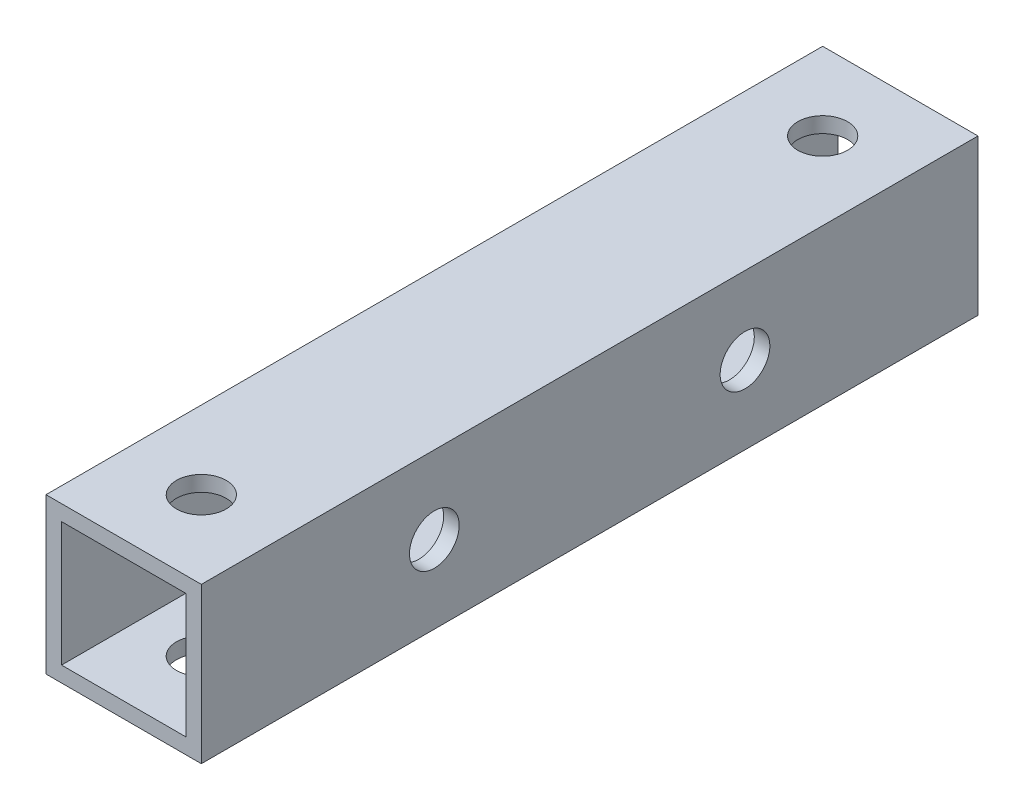
ISO-10303-21;
HEADER;
FILE_DESCRIPTION(('STEP AP214'),'2;1');
FILE_NAME('part.step','',(''),(''),'','','');
FILE_SCHEMA(('AUTOMOTIVE_DESIGN { 1 0 10303 214 1 1 1 1 }'));
ENDSEC;
DATA;
#1=APPLICATION_CONTEXT('core data for automotive mechanical design processes');
#2=APPLICATION_PROTOCOL_DEFINITION('international standard','automotive_design',2000,#1);
#3=PRODUCT_CONTEXT('',#1,'mechanical');
#4=PRODUCT('Part','Part','',(#3));
#5=PRODUCT_RELATED_PRODUCT_CATEGORY('part','',(#4));
#6=PRODUCT_DEFINITION_FORMATION('','',#4);
#7=PRODUCT_DEFINITION_CONTEXT('part definition',#1,'design');
#8=PRODUCT_DEFINITION('design','',#6,#7);
#9=PRODUCT_DEFINITION_SHAPE('','',#8);
#10=(LENGTH_UNIT() NAMED_UNIT(*) SI_UNIT(.MILLI.,.METRE.));
#11=(NAMED_UNIT(*) PLANE_ANGLE_UNIT() SI_UNIT($,.RADIAN.));
#12=(NAMED_UNIT(*) SI_UNIT($,.STERADIAN.) SOLID_ANGLE_UNIT());
#13=UNCERTAINTY_MEASURE_WITH_UNIT(LENGTH_MEASURE(1.E-05),#10,'distance_accuracy_value','');
#14=(GEOMETRIC_REPRESENTATION_CONTEXT(3) GLOBAL_UNCERTAINTY_ASSIGNED_CONTEXT((#13)) GLOBAL_UNIT_ASSIGNED_CONTEXT((#10,
#11,#12)) REPRESENTATION_CONTEXT('',''));
#15=CARTESIAN_POINT('',(0.,0.,0.));
#16=DIRECTION('',(0.,0.,1.));
#17=DIRECTION('',(1.,0.,0.));
#18=AXIS2_PLACEMENT_3D('',#15,#16,#17);
#19=CARTESIAN_POINT('',(0.,0.,50.));
#20=DIRECTION('',(0.,0.,1.));
#21=DIRECTION('',(1.,0.,0.));
#22=AXIS2_PLACEMENT_3D('',#19,#20,#21);
#23=PLANE('',#22);
#24=DIRECTION('',(0.,1.,0.));
#25=VECTOR('',#24,1.);
#26=CARTESIAN_POINT('',(5.,5.,50.));
#27=LINE('',#26,#25);
#28=CARTESIAN_POINT('',(5.,-5.,50.));
#29=VERTEX_POINT('',#28);
#30=CARTESIAN_POINT('',(5.,5.,50.));
#31=VERTEX_POINT('',#30);
#32=EDGE_CURVE('E140',#29,#31,#27,.T.);
#33=ORIENTED_EDGE('',*,*,#32,.T.);
#34=DIRECTION('',(-1.,0.,0.));
#35=VECTOR('',#34,1.);
#36=CARTESIAN_POINT('',(-5.,5.,50.));
#37=LINE('',#36,#35);
#38=CARTESIAN_POINT('',(-5.,5.,50.));
#39=VERTEX_POINT('',#38);
#40=EDGE_CURVE('E143',#31,#39,#37,.T.);
#41=ORIENTED_EDGE('',*,*,#40,.T.);
#42=DIRECTION('',(0.,-1.,0.));
#43=VECTOR('',#42,1.);
#44=CARTESIAN_POINT('',(-5.,5.,50.));
#45=LINE('',#44,#43);
#46=CARTESIAN_POINT('',(-5.,-5.,50.));
#47=VERTEX_POINT('',#46);
#48=EDGE_CURVE('E146',#39,#47,#45,.T.);
#49=ORIENTED_EDGE('',*,*,#48,.T.);
#50=DIRECTION('',(1.,0.,0.));
#51=VECTOR('',#50,1.);
#52=CARTESIAN_POINT('',(-5.,-5.,50.));
#53=LINE('',#52,#51);
#54=EDGE_CURVE('E148',#47,#29,#53,.T.);
#55=ORIENTED_EDGE('',*,*,#54,.T.);
#56=EDGE_LOOP('',(#33,#41,#49,#55));
#57=FACE_BOUND('',#56,.T.);
#58=DIRECTION('',(0.,-1.,0.));
#59=VECTOR('',#58,1.);
#60=CARTESIAN_POINT('',(-4.,4.,50.));
#61=LINE('',#60,#59);
#62=CARTESIAN_POINT('',(-4.,4.,50.));
#63=VERTEX_POINT('',#62);
#64=CARTESIAN_POINT('',(-4.,-4.,50.));
#65=VERTEX_POINT('',#64);
#66=EDGE_CURVE('E110',#63,#65,#61,.T.);
#67=ORIENTED_EDGE('',*,*,#66,.F.);
#68=DIRECTION('',(-1.,0.,0.));
#69=VECTOR('',#68,1.);
#70=CARTESIAN_POINT('',(-4.,4.,50.));
#71=LINE('',#70,#69);
#72=CARTESIAN_POINT('',(4.,4.,50.));
#73=VERTEX_POINT('',#72);
#74=EDGE_CURVE('E102',#73,#63,#71,.T.);
#75=ORIENTED_EDGE('',*,*,#74,.F.);
#76=DIRECTION('',(0.,1.,0.));
#77=VECTOR('',#76,1.);
#78=CARTESIAN_POINT('',(4.,4.,50.));
#79=LINE('',#78,#77);
#80=CARTESIAN_POINT('',(4.,-4.,50.));
#81=VERTEX_POINT('',#80);
#82=EDGE_CURVE('E124',#81,#73,#79,.T.);
#83=ORIENTED_EDGE('',*,*,#82,.F.);
#84=DIRECTION('',(1.,0.,0.));
#85=VECTOR('',#84,1.);
#86=CARTESIAN_POINT('',(-4.,-4.,50.));
#87=LINE('',#86,#85);
#88=EDGE_CURVE('E122',#65,#81,#87,.T.);
#89=ORIENTED_EDGE('',*,*,#88,.F.);
#90=EDGE_LOOP('',(#67,#75,#83,#89));
#91=FACE_BOUND('',#90,.T.);
#92=ADVANCED_FACE('F35',(#57,#91),#23,.T.);
#93=CARTESIAN_POINT('',(0.,0.,0.));
#94=DIRECTION('',(0.,0.,1.));
#95=DIRECTION('',(1.,0.,0.));
#96=AXIS2_PLACEMENT_3D('',#93,#94,#95);
#97=PLANE('',#96);
#98=DIRECTION('',(0.,1.,0.));
#99=VECTOR('',#98,1.);
#100=CARTESIAN_POINT('',(5.,5.,0.));
#101=LINE('',#100,#99);
#102=CARTESIAN_POINT('',(5.,-5.,0.));
#103=VERTEX_POINT('',#102);
#104=CARTESIAN_POINT('',(5.,5.,0.));
#105=VERTEX_POINT('',#104);
#106=EDGE_CURVE('E118',#103,#105,#101,.T.);
#107=ORIENTED_EDGE('',*,*,#106,.F.);
#108=DIRECTION('',(1.,0.,0.));
#109=VECTOR('',#108,1.);
#110=CARTESIAN_POINT('',(-5.,-5.,0.));
#111=LINE('',#110,#109);
#112=CARTESIAN_POINT('',(-5.,-5.,0.));
#113=VERTEX_POINT('',#112);
#114=EDGE_CURVE('E144',#113,#103,#111,.T.);
#115=ORIENTED_EDGE('',*,*,#114,.F.);
#116=DIRECTION('',(0.,-1.,0.));
#117=VECTOR('',#116,1.);
#118=CARTESIAN_POINT('',(-5.,5.,0.));
#119=LINE('',#118,#117);
#120=CARTESIAN_POINT('',(-5.,5.,0.));
#121=VERTEX_POINT('',#120);
#122=EDGE_CURVE('E155',#121,#113,#119,.T.);
#123=ORIENTED_EDGE('',*,*,#122,.F.);
#124=DIRECTION('',(-1.,0.,0.));
#125=VECTOR('',#124,1.);
#126=CARTESIAN_POINT('',(-5.,5.,0.));
#127=LINE('',#126,#125);
#128=EDGE_CURVE('E153',#105,#121,#127,.T.);
#129=ORIENTED_EDGE('',*,*,#128,.F.);
#130=EDGE_LOOP('',(#107,#115,#123,#129));
#131=FACE_BOUND('',#130,.T.);
#132=DIRECTION('',(-1.,0.,0.));
#133=VECTOR('',#132,1.);
#134=CARTESIAN_POINT('',(-4.,4.,0.));
#135=LINE('',#134,#133);
#136=CARTESIAN_POINT('',(4.,4.,0.));
#137=VERTEX_POINT('',#136);
#138=CARTESIAN_POINT('',(-4.,4.,0.));
#139=VERTEX_POINT('',#138);
#140=EDGE_CURVE('E60',#137,#139,#135,.T.);
#141=ORIENTED_EDGE('',*,*,#140,.T.);
#142=DIRECTION('',(0.,-1.,0.));
#143=VECTOR('',#142,1.);
#144=CARTESIAN_POINT('',(-4.,4.,0.));
#145=LINE('',#144,#143);
#146=CARTESIAN_POINT('',(-4.,-4.,0.));
#147=VERTEX_POINT('',#146);
#148=EDGE_CURVE('E117',#139,#147,#145,.T.);
#149=ORIENTED_EDGE('',*,*,#148,.T.);
#150=DIRECTION('',(1.,0.,0.));
#151=VECTOR('',#150,1.);
#152=CARTESIAN_POINT('',(-4.,-4.,0.));
#153=LINE('',#152,#151);
#154=CARTESIAN_POINT('',(4.,-4.,0.));
#155=VERTEX_POINT('',#154);
#156=EDGE_CURVE('E132',#147,#155,#153,.T.);
#157=ORIENTED_EDGE('',*,*,#156,.T.);
#158=DIRECTION('',(0.,1.,0.));
#159=VECTOR('',#158,1.);
#160=CARTESIAN_POINT('',(4.,4.,0.));
#161=LINE('',#160,#159);
#162=EDGE_CURVE('E111',#155,#137,#161,.T.);
#163=ORIENTED_EDGE('',*,*,#162,.T.);
#164=EDGE_LOOP('',(#141,#149,#157,#163));
#165=FACE_BOUND('',#164,.T.);
#166=ADVANCED_FACE('F243',(#131,#165),#97,.F.);
#167=CARTESIAN_POINT('',(5.,5.,50.));
#168=DIRECTION('',(-1.,0.,0.));
#169=DIRECTION('',(0.,-1.,0.));
#170=AXIS2_PLACEMENT_3D('',#167,#168,#169);
#171=PLANE('',#170);
#172=CARTESIAN_POINT('',(5.,0.,15.));
#173=DIRECTION('',(-1.,0.,0.));
#174=DIRECTION('',(0.,-1.,0.));
#175=AXIS2_PLACEMENT_3D('',#172,#173,#174);
#176=CIRCLE('',#175,1.6);
#177=CARTESIAN_POINT('',(5.,-1.6,15.));
#178=VERTEX_POINT('',#177);
#179=EDGE_CURVE('E175',#178,#178,#176,.T.);
#180=ORIENTED_EDGE('',*,*,#179,.T.);
#181=EDGE_LOOP('',(#180));
#182=FACE_BOUND('',#181,.T.);
#183=CARTESIAN_POINT('',(5.,0.,35.));
#184=DIRECTION('',(-1.,0.,0.));
#185=DIRECTION('',(0.,-1.,0.));
#186=AXIS2_PLACEMENT_3D('',#183,#184,#185);
#187=CIRCLE('',#186,1.60000000000001);
#188=CARTESIAN_POINT('',(5.,-1.6,35.));
#189=VERTEX_POINT('',#188);
#190=EDGE_CURVE('E186',#189,#189,#187,.T.);
#191=ORIENTED_EDGE('',*,*,#190,.T.);
#192=EDGE_LOOP('',(#191));
#193=FACE_BOUND('',#192,.T.);
#194=ORIENTED_EDGE('',*,*,#106,.T.);
#195=DIRECTION('',(0.,0.,-1.));
#196=VECTOR('',#195,1.);
#197=CARTESIAN_POINT('',(5.,5.,50.));
#198=LINE('',#197,#196);
#199=EDGE_CURVE('E11',#31,#105,#198,.T.);
#200=ORIENTED_EDGE('',*,*,#199,.F.);
#201=ORIENTED_EDGE('',*,*,#32,.F.);
#202=DIRECTION('',(0.,0.,-1.));
#203=VECTOR('',#202,1.);
#204=CARTESIAN_POINT('',(5.,-5.,50.));
#205=LINE('',#204,#203);
#206=EDGE_CURVE('E150',#29,#103,#205,.T.);
#207=ORIENTED_EDGE('',*,*,#206,.T.);
#208=EDGE_LOOP('',(#194,#200,#201,#207));
#209=FACE_BOUND('',#208,.T.);
#210=ADVANCED_FACE('F37',(#182,#193,#209),#171,.F.);
#211=CARTESIAN_POINT('',(-5.,5.,50.));
#212=DIRECTION('',(0.,-1.,0.));
#213=DIRECTION('',(0.,0.,-1.));
#214=AXIS2_PLACEMENT_3D('',#211,#212,#213);
#215=PLANE('',#214);
#216=CARTESIAN_POINT('',(0.,5.,45.));
#217=DIRECTION('',(0.,1.,0.));
#218=DIRECTION('',(0.,0.,1.));
#219=AXIS2_PLACEMENT_3D('',#216,#217,#218);
#220=CIRCLE('',#219,1.6);
#221=CARTESIAN_POINT('',(0.,5.,46.6));
#222=VERTEX_POINT('',#221);
#223=EDGE_CURVE('E200',#222,#222,#220,.T.);
#224=ORIENTED_EDGE('',*,*,#223,.F.);
#225=EDGE_LOOP('',(#224));
#226=FACE_BOUND('',#225,.T.);
#227=CARTESIAN_POINT('',(0.,5.,5.));
#228=DIRECTION('',(0.,1.,0.));
#229=DIRECTION('',(0.,0.,1.));
#230=AXIS2_PLACEMENT_3D('',#227,#228,#229);
#231=CIRCLE('',#230,1.6);
#232=CARTESIAN_POINT('',(0.,5.,6.6));
#233=VERTEX_POINT('',#232);
#234=EDGE_CURVE('E197',#233,#233,#231,.T.);
#235=ORIENTED_EDGE('',*,*,#234,.F.);
#236=EDGE_LOOP('',(#235));
#237=FACE_BOUND('',#236,.T.);
#238=ORIENTED_EDGE('',*,*,#128,.T.);
#239=DIRECTION('',(0.,0.,-1.));
#240=VECTOR('',#239,1.);
#241=CARTESIAN_POINT('',(-5.,5.,50.));
#242=LINE('',#241,#240);
#243=EDGE_CURVE('E44',#39,#121,#242,.T.);
#244=ORIENTED_EDGE('',*,*,#243,.F.);
#245=ORIENTED_EDGE('',*,*,#40,.F.);
#246=ORIENTED_EDGE('',*,*,#199,.T.);
#247=EDGE_LOOP('',(#238,#244,#245,#246));
#248=FACE_BOUND('',#247,.T.);
#249=ADVANCED_FACE('F229',(#226,#237,#248),#215,.F.);
#250=CARTESIAN_POINT('',(-5.,5.,50.));
#251=DIRECTION('',(1.,0.,0.));
#252=DIRECTION('',(0.,1.,0.));
#253=AXIS2_PLACEMENT_3D('',#250,#251,#252);
#254=PLANE('',#253);
#255=CARTESIAN_POINT('',(-5.,0.,15.));
#256=DIRECTION('',(-1.,0.,0.));
#257=DIRECTION('',(0.,-1.,0.));
#258=AXIS2_PLACEMENT_3D('',#255,#256,#257);
#259=CIRCLE('',#258,1.6);
#260=CARTESIAN_POINT('',(-5.,-1.6,15.));
#261=VERTEX_POINT('',#260);
#262=EDGE_CURVE('E181',#261,#261,#259,.T.);
#263=ORIENTED_EDGE('',*,*,#262,.F.);
#264=EDGE_LOOP('',(#263));
#265=FACE_BOUND('',#264,.T.);
#266=CARTESIAN_POINT('',(-5.,0.,35.));
#267=DIRECTION('',(-1.,0.,0.));
#268=DIRECTION('',(0.,-1.,0.));
#269=AXIS2_PLACEMENT_3D('',#266,#267,#268);
#270=CIRCLE('',#269,1.60000000000001);
#271=CARTESIAN_POINT('',(-5.,-1.60000000000001,35.));
#272=VERTEX_POINT('',#271);
#273=EDGE_CURVE('E191',#272,#272,#270,.T.);
#274=ORIENTED_EDGE('',*,*,#273,.F.);
#275=EDGE_LOOP('',(#274));
#276=FACE_BOUND('',#275,.T.);
#277=ORIENTED_EDGE('',*,*,#122,.T.);
#278=DIRECTION('',(0.,0.,-1.));
#279=VECTOR('',#278,1.);
#280=CARTESIAN_POINT('',(-5.,-5.,50.));
#281=LINE('',#280,#279);
#282=EDGE_CURVE('E160',#47,#113,#281,.T.);
#283=ORIENTED_EDGE('',*,*,#282,.F.);
#284=ORIENTED_EDGE('',*,*,#48,.F.);
#285=ORIENTED_EDGE('',*,*,#243,.T.);
#286=EDGE_LOOP('',(#277,#283,#284,#285));
#287=FACE_BOUND('',#286,.T.);
#288=ADVANCED_FACE('F232',(#265,#276,#287),#254,.F.);
#289=CARTESIAN_POINT('',(-5.,-5.,50.));
#290=DIRECTION('',(0.,1.,0.));
#291=DIRECTION('',(0.,0.,1.));
#292=AXIS2_PLACEMENT_3D('',#289,#290,#291);
#293=PLANE('',#292);
#294=CARTESIAN_POINT('',(0.,-5.,45.));
#295=DIRECTION('',(0.,1.,0.));
#296=DIRECTION('',(0.,0.,1.));
#297=AXIS2_PLACEMENT_3D('',#294,#295,#296);
#298=CIRCLE('',#297,1.6);
#299=CARTESIAN_POINT('',(0.,-5.,46.6));
#300=VERTEX_POINT('',#299);
#301=EDGE_CURVE('E169',#300,#300,#298,.T.);
#302=ORIENTED_EDGE('',*,*,#301,.T.);
#303=EDGE_LOOP('',(#302));
#304=FACE_BOUND('',#303,.T.);
#305=CARTESIAN_POINT('',(0.,-5.,5.));
#306=DIRECTION('',(0.,1.,0.));
#307=DIRECTION('',(0.,0.,1.));
#308=AXIS2_PLACEMENT_3D('',#305,#306,#307);
#309=CIRCLE('',#308,1.6);
#310=CARTESIAN_POINT('',(0.,-5.,6.6));
#311=VERTEX_POINT('',#310);
#312=EDGE_CURVE('E203',#311,#311,#309,.T.);
#313=ORIENTED_EDGE('',*,*,#312,.T.);
#314=EDGE_LOOP('',(#313));
#315=FACE_BOUND('',#314,.T.);
#316=ORIENTED_EDGE('',*,*,#114,.T.);
#317=ORIENTED_EDGE('',*,*,#206,.F.);
#318=ORIENTED_EDGE('',*,*,#54,.F.);
#319=ORIENTED_EDGE('',*,*,#282,.T.);
#320=EDGE_LOOP('',(#316,#317,#318,#319));
#321=FACE_BOUND('',#320,.T.);
#322=ADVANCED_FACE('F217',(#304,#315,#321),#293,.F.);
#323=CARTESIAN_POINT('',(-4.,4.,50.));
#324=DIRECTION('',(0.,-1.,0.));
#325=DIRECTION('',(0.,0.,-1.));
#326=AXIS2_PLACEMENT_3D('',#323,#324,#325);
#327=PLANE('',#326);
#328=CARTESIAN_POINT('',(0.,4.,45.));
#329=DIRECTION('',(0.,-1.,0.));
#330=DIRECTION('',(0.,0.,-1.));
#331=AXIS2_PLACEMENT_3D('',#328,#329,#330);
#332=CIRCLE('',#331,1.6);
#333=CARTESIAN_POINT('',(0.,4.,43.4));
#334=VERTEX_POINT('',#333);
#335=EDGE_CURVE('E130',#334,#334,#332,.T.);
#336=ORIENTED_EDGE('',*,*,#335,.F.);
#337=EDGE_LOOP('',(#336));
#338=FACE_BOUND('',#337,.T.);
#339=CARTESIAN_POINT('',(0.,4.,5.));
#340=DIRECTION('',(0.,-1.,0.));
#341=DIRECTION('',(0.,0.,-1.));
#342=AXIS2_PLACEMENT_3D('',#339,#340,#341);
#343=CIRCLE('',#342,1.6);
#344=CARTESIAN_POINT('',(0.,4.,3.4));
#345=VERTEX_POINT('',#344);
#346=EDGE_CURVE('E168',#345,#345,#343,.T.);
#347=ORIENTED_EDGE('',*,*,#346,.F.);
#348=EDGE_LOOP('',(#347));
#349=FACE_BOUND('',#348,.T.);
#350=ORIENTED_EDGE('',*,*,#140,.F.);
#351=DIRECTION('',(0.,0.,-1.));
#352=VECTOR('',#351,1.);
#353=CARTESIAN_POINT('',(4.,4.,50.));
#354=LINE('',#353,#352);
#355=EDGE_CURVE('E106',#73,#137,#354,.T.);
#356=ORIENTED_EDGE('',*,*,#355,.F.);
#357=ORIENTED_EDGE('',*,*,#74,.T.);
#358=DIRECTION('',(0.,0.,-1.));
#359=VECTOR('',#358,1.);
#360=CARTESIAN_POINT('',(-4.,4.,50.));
#361=LINE('',#360,#359);
#362=EDGE_CURVE('E105',#63,#139,#361,.T.);
#363=ORIENTED_EDGE('',*,*,#362,.T.);
#364=EDGE_LOOP('',(#350,#356,#357,#363));
#365=FACE_BOUND('',#364,.T.);
#366=ADVANCED_FACE('F104',(#338,#349,#365),#327,.T.);
#367=CARTESIAN_POINT('',(-4.,4.,50.));
#368=DIRECTION('',(1.,0.,0.));
#369=DIRECTION('',(0.,1.,0.));
#370=AXIS2_PLACEMENT_3D('',#367,#368,#369);
#371=PLANE('',#370);
#372=CARTESIAN_POINT('',(-4.,0.,15.));
#373=DIRECTION('',(1.,0.,0.));
#374=DIRECTION('',(0.,1.,0.));
#375=AXIS2_PLACEMENT_3D('',#372,#373,#374);
#376=CIRCLE('',#375,1.6);
#377=CARTESIAN_POINT('',(-4.,-1.6,15.));
#378=VERTEX_POINT('',#377);
#379=EDGE_CURVE('E194',#378,#378,#376,.T.);
#380=ORIENTED_EDGE('',*,*,#379,.F.);
#381=EDGE_LOOP('',(#380));
#382=FACE_BOUND('',#381,.T.);
#383=CARTESIAN_POINT('',(-4.,0.,35.));
#384=DIRECTION('',(1.,0.,0.));
#385=DIRECTION('',(0.,1.,0.));
#386=AXIS2_PLACEMENT_3D('',#383,#384,#385);
#387=CIRCLE('',#386,1.60000000000001);
#388=CARTESIAN_POINT('',(-4.,-1.60000000000001,35.));
#389=VERTEX_POINT('',#388);
#390=EDGE_CURVE('E174',#389,#389,#387,.T.);
#391=ORIENTED_EDGE('',*,*,#390,.F.);
#392=EDGE_LOOP('',(#391));
#393=FACE_BOUND('',#392,.T.);
#394=ORIENTED_EDGE('',*,*,#148,.F.);
#395=ORIENTED_EDGE('',*,*,#362,.F.);
#396=ORIENTED_EDGE('',*,*,#66,.T.);
#397=DIRECTION('',(0.,0.,-1.));
#398=VECTOR('',#397,1.);
#399=CARTESIAN_POINT('',(-4.,-4.,50.));
#400=LINE('',#399,#398);
#401=EDGE_CURVE('E119',#65,#147,#400,.T.);
#402=ORIENTED_EDGE('',*,*,#401,.T.);
#403=EDGE_LOOP('',(#394,#395,#396,#402));
#404=FACE_BOUND('',#403,.T.);
#405=ADVANCED_FACE('F114',(#382,#393,#404),#371,.T.);
#406=CARTESIAN_POINT('',(-4.,-4.,50.));
#407=DIRECTION('',(0.,1.,0.));
#408=DIRECTION('',(-1.,0.,0.));
#409=AXIS2_PLACEMENT_3D('',#406,#407,#408);
#410=PLANE('',#409);
#411=CARTESIAN_POINT('',(0.,-4.,45.));
#412=DIRECTION('',(0.,1.,0.));
#413=DIRECTION('',(-1.,0.,0.));
#414=AXIS2_PLACEMENT_3D('',#411,#412,#413);
#415=CIRCLE('',#414,1.6);
#416=CARTESIAN_POINT('',(-1.6,-4.,45.));
#417=VERTEX_POINT('',#416);
#418=EDGE_CURVE('E170',#417,#417,#415,.T.);
#419=ORIENTED_EDGE('',*,*,#418,.F.);
#420=EDGE_LOOP('',(#419));
#421=FACE_BOUND('',#420,.T.);
#422=CARTESIAN_POINT('',(0.,-4.,5.));
#423=DIRECTION('',(0.,1.,0.));
#424=DIRECTION('',(-1.,0.,0.));
#425=AXIS2_PLACEMENT_3D('',#422,#423,#424);
#426=CIRCLE('',#425,1.6);
#427=CARTESIAN_POINT('',(-1.6,-4.,5.));
#428=VERTEX_POINT('',#427);
#429=EDGE_CURVE('E165',#428,#428,#426,.T.);
#430=ORIENTED_EDGE('',*,*,#429,.F.);
#431=EDGE_LOOP('',(#430));
#432=FACE_BOUND('',#431,.T.);
#433=ORIENTED_EDGE('',*,*,#156,.F.);
#434=ORIENTED_EDGE('',*,*,#401,.F.);
#435=ORIENTED_EDGE('',*,*,#88,.T.);
#436=DIRECTION('',(0.,0.,-1.));
#437=VECTOR('',#436,1.);
#438=CARTESIAN_POINT('',(4.,-4.,50.));
#439=LINE('',#438,#437);
#440=EDGE_CURVE('E52',#81,#155,#439,.T.);
#441=ORIENTED_EDGE('',*,*,#440,.T.);
#442=EDGE_LOOP('',(#433,#434,#435,#441));
#443=FACE_BOUND('',#442,.T.);
#444=ADVANCED_FACE('F324',(#421,#432,#443),#410,.T.);
#445=CARTESIAN_POINT('',(4.,4.,50.));
#446=DIRECTION('',(-1.,0.,0.));
#447=DIRECTION('',(0.,-1.,0.));
#448=AXIS2_PLACEMENT_3D('',#445,#446,#447);
#449=PLANE('',#448);
#450=CARTESIAN_POINT('',(4.,0.,15.));
#451=DIRECTION('',(-1.,0.,0.));
#452=DIRECTION('',(0.,-1.,0.));
#453=AXIS2_PLACEMENT_3D('',#450,#451,#452);
#454=CIRCLE('',#453,1.6);
#455=CARTESIAN_POINT('',(4.,-1.6,15.));
#456=VERTEX_POINT('',#455);
#457=EDGE_CURVE('E39',#456,#456,#454,.T.);
#458=ORIENTED_EDGE('',*,*,#457,.F.);
#459=EDGE_LOOP('',(#458));
#460=FACE_BOUND('',#459,.T.);
#461=CARTESIAN_POINT('',(4.,0.,35.));
#462=DIRECTION('',(-1.,0.,0.));
#463=DIRECTION('',(0.,-1.,0.));
#464=AXIS2_PLACEMENT_3D('',#461,#462,#463);
#465=CIRCLE('',#464,1.60000000000001);
#466=CARTESIAN_POINT('',(4.,-1.6,35.));
#467=VERTEX_POINT('',#466);
#468=EDGE_CURVE('E172',#467,#467,#465,.T.);
#469=ORIENTED_EDGE('',*,*,#468,.F.);
#470=EDGE_LOOP('',(#469));
#471=FACE_BOUND('',#470,.T.);
#472=ORIENTED_EDGE('',*,*,#162,.F.);
#473=ORIENTED_EDGE('',*,*,#440,.F.);
#474=ORIENTED_EDGE('',*,*,#82,.T.);
#475=ORIENTED_EDGE('',*,*,#355,.T.);
#476=EDGE_LOOP('',(#472,#473,#474,#475));
#477=FACE_BOUND('',#476,.T.);
#478=ADVANCED_FACE('F329',(#460,#471,#477),#449,.T.);
#479=CARTESIAN_POINT('',(0.,-5.,5.));
#480=DIRECTION('',(0.,1.,0.));
#481=DIRECTION('',(0.,0.,1.));
#482=AXIS2_PLACEMENT_3D('',#479,#480,#481);
#483=CYLINDRICAL_SURFACE('',#482,1.6);
#484=ORIENTED_EDGE('',*,*,#429,.T.);
#485=EDGE_LOOP('',(#484));
#486=FACE_BOUND('',#485,.T.);
#487=ORIENTED_EDGE('',*,*,#312,.F.);
#488=EDGE_LOOP('',(#487));
#489=FACE_BOUND('',#488,.T.);
#490=ADVANCED_FACE('F226',(#486,#489),#483,.F.);
#491=CARTESIAN_POINT('',(0.,-5.,45.));
#492=DIRECTION('',(0.,1.,0.));
#493=DIRECTION('',(0.,0.,1.));
#494=AXIS2_PLACEMENT_3D('',#491,#492,#493);
#495=CYLINDRICAL_SURFACE('',#494,1.6);
#496=ORIENTED_EDGE('',*,*,#418,.T.);
#497=EDGE_LOOP('',(#496));
#498=FACE_BOUND('',#497,.T.);
#499=ORIENTED_EDGE('',*,*,#301,.F.);
#500=EDGE_LOOP('',(#499));
#501=FACE_BOUND('',#500,.T.);
#502=ADVANCED_FACE('F224',(#498,#501),#495,.F.);
#503=ORIENTED_EDGE('',*,*,#346,.T.);
#504=EDGE_LOOP('',(#503));
#505=FACE_BOUND('',#504,.T.);
#506=ORIENTED_EDGE('',*,*,#234,.T.);
#507=EDGE_LOOP('',(#506));
#508=FACE_BOUND('',#507,.T.);
#509=ADVANCED_FACE('F221',(#505,#508),#483,.F.);
#510=ORIENTED_EDGE('',*,*,#335,.T.);
#511=EDGE_LOOP('',(#510));
#512=FACE_BOUND('',#511,.T.);
#513=ORIENTED_EDGE('',*,*,#223,.T.);
#514=EDGE_LOOP('',(#513));
#515=FACE_BOUND('',#514,.T.);
#516=ADVANCED_FACE('F212',(#512,#515),#495,.F.);
#517=CARTESIAN_POINT('',(5.,0.,35.));
#518=DIRECTION('',(-1.,0.,0.));
#519=DIRECTION('',(0.,-1.,0.));
#520=AXIS2_PLACEMENT_3D('',#517,#518,#519);
#521=CYLINDRICAL_SURFACE('',#520,1.60000000000001);
#522=CARTESIAN_POINT('',(4.,-1.6,35.));
#523=CARTESIAN_POINT('',(4.01041666666667,-1.6,35.));
#524=CARTESIAN_POINT('',(4.02083333333333,-1.6,35.));
#525=CARTESIAN_POINT('',(4.04166666666667,-1.6,35.));
#526=CARTESIAN_POINT('',(4.05208333333333,-1.6,35.));
#527=CARTESIAN_POINT('',(4.07291666666667,-1.6,35.));
#528=CARTESIAN_POINT('',(4.08333333333333,-1.6,35.));
#529=CARTESIAN_POINT('',(4.10416666666667,-1.6,35.));
#530=CARTESIAN_POINT('',(4.11458333333333,-1.6,35.));
#531=CARTESIAN_POINT('',(4.13541666666667,-1.6,35.));
#532=CARTESIAN_POINT('',(4.14583333333333,-1.6,35.));
#533=CARTESIAN_POINT('',(4.16666666666667,-1.6,35.));
#534=CARTESIAN_POINT('',(4.17708333333333,-1.6,35.));
#535=CARTESIAN_POINT('',(4.19791666666667,-1.6,35.));
#536=CARTESIAN_POINT('',(4.20833333333333,-1.6,35.));
#537=CARTESIAN_POINT('',(4.22916666666667,-1.6,35.));
#538=CARTESIAN_POINT('',(4.23958333333333,-1.6,35.));
#539=CARTESIAN_POINT('',(4.26041666666667,-1.6,35.));
#540=CARTESIAN_POINT('',(4.27083333333333,-1.6,35.));
#541=CARTESIAN_POINT('',(4.29166666666667,-1.6,35.));
#542=CARTESIAN_POINT('',(4.30208333333333,-1.6,35.));
#543=CARTESIAN_POINT('',(4.32291666666667,-1.6,35.));
#544=CARTESIAN_POINT('',(4.33333333333333,-1.6,35.));
#545=CARTESIAN_POINT('',(4.35416666666667,-1.6,35.));
#546=CARTESIAN_POINT('',(4.36458333333333,-1.6,35.));
#547=CARTESIAN_POINT('',(4.38541666666667,-1.6,35.));
#548=CARTESIAN_POINT('',(4.39583333333333,-1.6,35.));
#549=CARTESIAN_POINT('',(4.41666666666667,-1.6,35.));
#550=CARTESIAN_POINT('',(4.42708333333333,-1.6,35.));
#551=CARTESIAN_POINT('',(4.44791666666667,-1.6,35.));
#552=CARTESIAN_POINT('',(4.45833333333333,-1.6,35.));
#553=CARTESIAN_POINT('',(4.47916666666667,-1.6,35.));
#554=CARTESIAN_POINT('',(4.48958333333333,-1.6,35.));
#555=CARTESIAN_POINT('',(4.51041666666667,-1.6,35.));
#556=CARTESIAN_POINT('',(4.52083333333333,-1.6,35.));
#557=CARTESIAN_POINT('',(4.54166666666667,-1.6,35.));
#558=CARTESIAN_POINT('',(4.55208333333333,-1.6,35.));
#559=CARTESIAN_POINT('',(4.57291666666667,-1.6,35.));
#560=CARTESIAN_POINT('',(4.58333333333334,-1.6,35.));
#561=CARTESIAN_POINT('',(4.60416666666667,-1.6,35.));
#562=CARTESIAN_POINT('',(4.61458333333334,-1.6,35.));
#563=CARTESIAN_POINT('',(4.63541666666667,-1.6,35.));
#564=CARTESIAN_POINT('',(4.64583333333334,-1.6,35.));
#565=CARTESIAN_POINT('',(4.66666666666667,-1.6,35.));
#566=CARTESIAN_POINT('',(4.67708333333334,-1.6,35.));
#567=CARTESIAN_POINT('',(4.69791666666667,-1.6,35.));
#568=CARTESIAN_POINT('',(4.70833333333334,-1.6,35.));
#569=CARTESIAN_POINT('',(4.72916666666667,-1.6,35.));
#570=CARTESIAN_POINT('',(4.73958333333334,-1.6,35.));
#571=CARTESIAN_POINT('',(4.76041666666667,-1.6,35.));
#572=CARTESIAN_POINT('',(4.77083333333334,-1.6,35.));
#573=CARTESIAN_POINT('',(4.79166666666667,-1.6,35.));
#574=CARTESIAN_POINT('',(4.80208333333334,-1.6,35.));
#575=CARTESIAN_POINT('',(4.82291666666667,-1.6,35.));
#576=CARTESIAN_POINT('',(4.83333333333334,-1.6,35.));
#577=CARTESIAN_POINT('',(4.85416666666667,-1.6,35.));
#578=CARTESIAN_POINT('',(4.86458333333334,-1.6,35.));
#579=CARTESIAN_POINT('',(4.88541666666667,-1.6,35.));
#580=CARTESIAN_POINT('',(4.89583333333334,-1.6,35.));
#581=CARTESIAN_POINT('',(4.91666666666667,-1.6,35.));
#582=CARTESIAN_POINT('',(4.92708333333334,-1.6,35.));
#583=CARTESIAN_POINT('',(4.94791666666667,-1.6,35.));
#584=CARTESIAN_POINT('',(4.95833333333334,-1.6,35.));
#585=CARTESIAN_POINT('',(4.97916666666667,-1.6,35.));
#586=CARTESIAN_POINT('',(4.98958333333334,-1.6,35.));
#587=CARTESIAN_POINT('',(5.,-1.6,35.));
#588=B_SPLINE_CURVE_WITH_KNOTS('',3,(#522,#523,#524,#525,#526,#527,#528,#529,#530,#531,#532,
#533,#534,#535,#536,#537,#538,#539,#540,#541,#542,#543,#544,#545,#546,#547,#548,#549,#550,#551,
#552,#553,#554,#555,#556,#557,#558,#559,#560,#561,#562,#563,#564,#565,#566,#567,#568,#569,#570,
#571,#572,#573,#574,#575,#576,#577,#578,#579,#580,#581,#582,#583,#584,#585,#586,#587),
.UNSPECIFIED.,.F.,.F.,(4,2,2,2,2,2,2,2,2,2,2,2,2,2,2,2,2,2,2,2,2,2,2,2,2,2,2,2,2,2,2,2,4),(0.,
0.03125,0.0625000000000001,0.0937500000000009,0.125000000000001,0.156250000000001,
0.187500000000001,0.218750000000001,0.250000000000001,0.281250000000001,0.312500000000001,
0.343750000000002,0.375000000000002,0.406250000000002,0.437500000000002,0.468750000000002,
0.500000000000002,0.531250000000002,0.562500000000003,0.593750000000003,0.625000000000003,
0.656250000000003,0.687500000000003,0.718750000000003,0.750000000000003,0.781250000000004,
0.812500000000004,0.843750000000004,0.875000000000004,0.906250000000004,0.937500000000004,
0.968750000000004,1.),.UNSPECIFIED.);
#589=EDGE_CURVE('BSEAM276',#467,#189,#588,.T.);
#590=ORIENTED_EDGE('',*,*,#468,.T.);
#591=ORIENTED_EDGE('',*,*,#190,.F.);
#592=ORIENTED_EDGE('',*,*,#589,.T.);
#593=ORIENTED_EDGE('',*,*,#589,.F.);
#594=EDGE_LOOP('',(#590,#592,#591,#593));
#595=FACE_BOUND('',#594,.T.);
#596=ADVANCED_FACE('F276',(#595),#521,.F.);
#597=CARTESIAN_POINT('',(5.,0.,15.));
#598=DIRECTION('',(-1.,0.,0.));
#599=DIRECTION('',(0.,-1.,0.));
#600=AXIS2_PLACEMENT_3D('',#597,#598,#599);
#601=CYLINDRICAL_SURFACE('',#600,1.6);
#602=CARTESIAN_POINT('',(4.,-1.6,15.));
#603=CARTESIAN_POINT('',(4.01041666666667,-1.6,15.));
#604=CARTESIAN_POINT('',(4.02083333333333,-1.6,15.));
#605=CARTESIAN_POINT('',(4.04166666666667,-1.6,15.));
#606=CARTESIAN_POINT('',(4.05208333333333,-1.6,15.));
#607=CARTESIAN_POINT('',(4.07291666666667,-1.6,15.));
#608=CARTESIAN_POINT('',(4.08333333333333,-1.6,15.));
#609=CARTESIAN_POINT('',(4.10416666666667,-1.6,15.));
#610=CARTESIAN_POINT('',(4.11458333333333,-1.6,15.));
#611=CARTESIAN_POINT('',(4.13541666666667,-1.6,15.));
#612=CARTESIAN_POINT('',(4.14583333333333,-1.6,15.));
#613=CARTESIAN_POINT('',(4.16666666666667,-1.6,15.));
#614=CARTESIAN_POINT('',(4.17708333333333,-1.6,15.));
#615=CARTESIAN_POINT('',(4.19791666666667,-1.6,15.));
#616=CARTESIAN_POINT('',(4.20833333333333,-1.6,15.));
#617=CARTESIAN_POINT('',(4.22916666666667,-1.6,15.));
#618=CARTESIAN_POINT('',(4.23958333333333,-1.6,15.));
#619=CARTESIAN_POINT('',(4.26041666666667,-1.6,15.));
#620=CARTESIAN_POINT('',(4.27083333333333,-1.6,15.));
#621=CARTESIAN_POINT('',(4.29166666666667,-1.6,15.));
#622=CARTESIAN_POINT('',(4.30208333333333,-1.6,15.));
#623=CARTESIAN_POINT('',(4.32291666666667,-1.6,15.));
#624=CARTESIAN_POINT('',(4.33333333333333,-1.6,15.));
#625=CARTESIAN_POINT('',(4.35416666666667,-1.6,15.));
#626=CARTESIAN_POINT('',(4.36458333333333,-1.6,15.));
#627=CARTESIAN_POINT('',(4.38541666666667,-1.6,15.));
#628=CARTESIAN_POINT('',(4.39583333333333,-1.6,15.));
#629=CARTESIAN_POINT('',(4.41666666666667,-1.6,15.));
#630=CARTESIAN_POINT('',(4.42708333333333,-1.6,15.));
#631=CARTESIAN_POINT('',(4.44791666666667,-1.6,15.));
#632=CARTESIAN_POINT('',(4.45833333333333,-1.6,15.));
#633=CARTESIAN_POINT('',(4.47916666666667,-1.6,15.));
#634=CARTESIAN_POINT('',(4.48958333333333,-1.6,15.));
#635=CARTESIAN_POINT('',(4.51041666666667,-1.6,15.));
#636=CARTESIAN_POINT('',(4.52083333333333,-1.6,15.));
#637=CARTESIAN_POINT('',(4.54166666666667,-1.6,15.));
#638=CARTESIAN_POINT('',(4.55208333333333,-1.6,15.));
#639=CARTESIAN_POINT('',(4.57291666666667,-1.6,15.));
#640=CARTESIAN_POINT('',(4.58333333333334,-1.6,15.));
#641=CARTESIAN_POINT('',(4.60416666666667,-1.6,15.));
#642=CARTESIAN_POINT('',(4.61458333333334,-1.6,15.));
#643=CARTESIAN_POINT('',(4.63541666666667,-1.6,15.));
#644=CARTESIAN_POINT('',(4.64583333333334,-1.6,15.));
#645=CARTESIAN_POINT('',(4.66666666666667,-1.6,15.));
#646=CARTESIAN_POINT('',(4.67708333333334,-1.6,15.));
#647=CARTESIAN_POINT('',(4.69791666666667,-1.6,15.));
#648=CARTESIAN_POINT('',(4.70833333333334,-1.6,15.));
#649=CARTESIAN_POINT('',(4.72916666666667,-1.6,15.));
#650=CARTESIAN_POINT('',(4.73958333333334,-1.6,15.));
#651=CARTESIAN_POINT('',(4.76041666666667,-1.6,15.));
#652=CARTESIAN_POINT('',(4.77083333333334,-1.6,15.));
#653=CARTESIAN_POINT('',(4.79166666666667,-1.6,15.));
#654=CARTESIAN_POINT('',(4.80208333333334,-1.6,15.));
#655=CARTESIAN_POINT('',(4.82291666666667,-1.6,15.));
#656=CARTESIAN_POINT('',(4.83333333333334,-1.6,15.));
#657=CARTESIAN_POINT('',(4.85416666666667,-1.6,15.));
#658=CARTESIAN_POINT('',(4.86458333333334,-1.6,15.));
#659=CARTESIAN_POINT('',(4.88541666666667,-1.6,15.));
#660=CARTESIAN_POINT('',(4.89583333333334,-1.6,15.));
#661=CARTESIAN_POINT('',(4.91666666666667,-1.6,15.));
#662=CARTESIAN_POINT('',(4.92708333333334,-1.6,15.));
#663=CARTESIAN_POINT('',(4.94791666666667,-1.6,15.));
#664=CARTESIAN_POINT('',(4.95833333333334,-1.6,15.));
#665=CARTESIAN_POINT('',(4.97916666666667,-1.6,15.));
#666=CARTESIAN_POINT('',(4.98958333333334,-1.6,15.));
#667=CARTESIAN_POINT('',(5.,-1.6,15.));
#668=B_SPLINE_CURVE_WITH_KNOTS('',3,(#602,#603,#604,#605,#606,#607,#608,#609,#610,#611,#612,
#613,#614,#615,#616,#617,#618,#619,#620,#621,#622,#623,#624,#625,#626,#627,#628,#629,#630,#631,
#632,#633,#634,#635,#636,#637,#638,#639,#640,#641,#642,#643,#644,#645,#646,#647,#648,#649,#650,
#651,#652,#653,#654,#655,#656,#657,#658,#659,#660,#661,#662,#663,#664,#665,#666,#667),
.UNSPECIFIED.,.F.,.F.,(4,2,2,2,2,2,2,2,2,2,2,2,2,2,2,2,2,2,2,2,2,2,2,2,2,2,2,2,2,2,2,2,4),(0.,
0.03125,0.0625000000000001,0.0937500000000009,0.125000000000001,0.156250000000001,
0.187500000000001,0.218750000000001,0.250000000000001,0.281250000000001,0.312500000000001,
0.343750000000002,0.375000000000002,0.406250000000002,0.437500000000002,0.468750000000002,
0.500000000000002,0.531250000000002,0.562500000000003,0.593750000000003,0.625000000000003,
0.656250000000003,0.687500000000003,0.718750000000003,0.750000000000003,0.781250000000004,
0.812500000000004,0.843750000000004,0.875000000000004,0.906250000000004,0.937500000000004,
0.968750000000004,1.),.UNSPECIFIED.);
#669=EDGE_CURVE('BSEAM273',#456,#178,#668,.T.);
#670=ORIENTED_EDGE('',*,*,#457,.T.);
#671=ORIENTED_EDGE('',*,*,#179,.F.);
#672=ORIENTED_EDGE('',*,*,#669,.T.);
#673=ORIENTED_EDGE('',*,*,#669,.F.);
#674=EDGE_LOOP('',(#670,#672,#671,#673));
#675=FACE_BOUND('',#674,.T.);
#676=ADVANCED_FACE('F273',(#675),#601,.F.);
#677=CARTESIAN_POINT('',(-4.,-1.60000000000001,35.));
#678=CARTESIAN_POINT('',(-4.01041666666667,-1.60000000000001,35.));
#679=CARTESIAN_POINT('',(-4.02083333333333,-1.60000000000001,35.));
#680=CARTESIAN_POINT('',(-4.04166666666667,-1.60000000000001,35.));
#681=CARTESIAN_POINT('',(-4.05208333333333,-1.60000000000001,35.));
#682=CARTESIAN_POINT('',(-4.07291666666667,-1.60000000000001,35.));
#683=CARTESIAN_POINT('',(-4.08333333333333,-1.60000000000001,35.));
#684=CARTESIAN_POINT('',(-4.10416666666667,-1.60000000000001,35.));
#685=CARTESIAN_POINT('',(-4.11458333333333,-1.60000000000001,35.));
#686=CARTESIAN_POINT('',(-4.13541666666667,-1.60000000000001,35.));
#687=CARTESIAN_POINT('',(-4.14583333333333,-1.60000000000001,35.));
#688=CARTESIAN_POINT('',(-4.16666666666667,-1.60000000000001,35.));
#689=CARTESIAN_POINT('',(-4.17708333333333,-1.60000000000001,35.));
#690=CARTESIAN_POINT('',(-4.19791666666667,-1.60000000000001,35.));
#691=CARTESIAN_POINT('',(-4.20833333333333,-1.60000000000001,35.));
#692=CARTESIAN_POINT('',(-4.22916666666667,-1.60000000000001,35.));
#693=CARTESIAN_POINT('',(-4.23958333333333,-1.60000000000001,35.));
#694=CARTESIAN_POINT('',(-4.26041666666667,-1.60000000000001,35.));
#695=CARTESIAN_POINT('',(-4.27083333333333,-1.60000000000001,35.));
#696=CARTESIAN_POINT('',(-4.29166666666667,-1.60000000000001,35.));
#697=CARTESIAN_POINT('',(-4.30208333333333,-1.60000000000001,35.));
#698=CARTESIAN_POINT('',(-4.32291666666667,-1.60000000000001,35.));
#699=CARTESIAN_POINT('',(-4.33333333333333,-1.60000000000001,35.));
#700=CARTESIAN_POINT('',(-4.35416666666667,-1.60000000000001,35.));
#701=CARTESIAN_POINT('',(-4.36458333333333,-1.60000000000001,35.));
#702=CARTESIAN_POINT('',(-4.38541666666667,-1.60000000000001,35.));
#703=CARTESIAN_POINT('',(-4.39583333333333,-1.60000000000001,35.));
#704=CARTESIAN_POINT('',(-4.41666666666667,-1.60000000000001,35.));
#705=CARTESIAN_POINT('',(-4.42708333333333,-1.60000000000001,35.));
#706=CARTESIAN_POINT('',(-4.44791666666667,-1.60000000000001,35.));
#707=CARTESIAN_POINT('',(-4.45833333333333,-1.60000000000001,35.));
#708=CARTESIAN_POINT('',(-4.47916666666667,-1.60000000000001,35.));
#709=CARTESIAN_POINT('',(-4.48958333333333,-1.60000000000001,35.));
#710=CARTESIAN_POINT('',(-4.51041666666667,-1.60000000000001,35.));
#711=CARTESIAN_POINT('',(-4.52083333333333,-1.60000000000001,35.));
#712=CARTESIAN_POINT('',(-4.54166666666667,-1.60000000000001,35.));
#713=CARTESIAN_POINT('',(-4.55208333333333,-1.60000000000001,35.));
#714=CARTESIAN_POINT('',(-4.57291666666667,-1.60000000000001,35.));
#715=CARTESIAN_POINT('',(-4.58333333333333,-1.60000000000001,35.));
#716=CARTESIAN_POINT('',(-4.60416666666667,-1.60000000000001,35.));
#717=CARTESIAN_POINT('',(-4.61458333333333,-1.60000000000001,35.));
#718=CARTESIAN_POINT('',(-4.63541666666667,-1.60000000000001,35.));
#719=CARTESIAN_POINT('',(-4.64583333333333,-1.60000000000001,35.));
#720=CARTESIAN_POINT('',(-4.66666666666667,-1.60000000000001,35.));
#721=CARTESIAN_POINT('',(-4.67708333333333,-1.60000000000001,35.));
#722=CARTESIAN_POINT('',(-4.69791666666667,-1.60000000000001,35.));
#723=CARTESIAN_POINT('',(-4.70833333333333,-1.60000000000001,35.));
#724=CARTESIAN_POINT('',(-4.72916666666667,-1.60000000000001,35.));
#725=CARTESIAN_POINT('',(-4.73958333333333,-1.60000000000001,35.));
#726=CARTESIAN_POINT('',(-4.76041666666667,-1.60000000000001,35.));
#727=CARTESIAN_POINT('',(-4.77083333333333,-1.60000000000001,35.));
#728=CARTESIAN_POINT('',(-4.79166666666667,-1.60000000000001,35.));
#729=CARTESIAN_POINT('',(-4.80208333333333,-1.60000000000001,35.));
#730=CARTESIAN_POINT('',(-4.82291666666667,-1.60000000000001,35.));
#731=CARTESIAN_POINT('',(-4.83333333333333,-1.60000000000001,35.));
#732=CARTESIAN_POINT('',(-4.85416666666667,-1.60000000000001,35.));
#733=CARTESIAN_POINT('',(-4.86458333333333,-1.60000000000001,35.));
#734=CARTESIAN_POINT('',(-4.88541666666667,-1.60000000000001,35.));
#735=CARTESIAN_POINT('',(-4.89583333333333,-1.60000000000001,35.));
#736=CARTESIAN_POINT('',(-4.91666666666667,-1.60000000000001,35.));
#737=CARTESIAN_POINT('',(-4.92708333333333,-1.60000000000001,35.));
#738=CARTESIAN_POINT('',(-4.94791666666667,-1.60000000000001,35.));
#739=CARTESIAN_POINT('',(-4.95833333333333,-1.60000000000001,35.));
#740=CARTESIAN_POINT('',(-4.97916666666667,-1.60000000000001,35.));
#741=CARTESIAN_POINT('',(-4.98958333333333,-1.60000000000001,35.));
#742=CARTESIAN_POINT('',(-5.,-1.60000000000001,35.));
#743=B_SPLINE_CURVE_WITH_KNOTS('',3,(#677,#678,#679,#680,#681,#682,#683,#684,#685,#686,#687,
#688,#689,#690,#691,#692,#693,#694,#695,#696,#697,#698,#699,#700,#701,#702,#703,#704,#705,#706,
#707,#708,#709,#710,#711,#712,#713,#714,#715,#716,#717,#718,#719,#720,#721,#722,#723,#724,#725,
#726,#727,#728,#729,#730,#731,#732,#733,#734,#735,#736,#737,#738,#739,#740,#741,#742),
.UNSPECIFIED.,.F.,.F.,(4,2,2,2,2,2,2,2,2,2,2,2,2,2,2,2,2,2,2,2,2,2,2,2,2,2,2,2,2,2,2,2,4),(0.,
0.03125,0.0625000000000001,0.0937500000000001,0.125,0.15625,0.1875,0.21875,0.25,0.28125,0.3125,
0.34375,0.375,0.40625,0.4375,0.46875,0.5,0.53125,0.5625,0.593750000000001,0.625000000000001,
0.656250000000001,0.687500000000001,0.718750000000001,0.750000000000001,0.781250000000001,
0.812500000000001,0.843750000000001,0.875000000000001,0.906250000000001,0.937500000000001,
0.968750000000001,1.),.UNSPECIFIED.);
#744=EDGE_CURVE('BSEAM270',#389,#272,#743,.T.);
#745=ORIENTED_EDGE('',*,*,#390,.T.);
#746=ORIENTED_EDGE('',*,*,#273,.T.);
#747=ORIENTED_EDGE('',*,*,#744,.T.);
#748=ORIENTED_EDGE('',*,*,#744,.F.);
#749=EDGE_LOOP('',(#745,#747,#746,#748));
#750=FACE_BOUND('',#749,.T.);
#751=ADVANCED_FACE('F270',(#750),#521,.F.);
#752=CARTESIAN_POINT('',(-4.,-1.6,15.));
#753=CARTESIAN_POINT('',(-4.01041666666667,-1.6,15.));
#754=CARTESIAN_POINT('',(-4.02083333333333,-1.6,15.));
#755=CARTESIAN_POINT('',(-4.04166666666667,-1.6,15.));
#756=CARTESIAN_POINT('',(-4.05208333333333,-1.6,15.));
#757=CARTESIAN_POINT('',(-4.07291666666667,-1.6,15.));
#758=CARTESIAN_POINT('',(-4.08333333333333,-1.6,15.));
#759=CARTESIAN_POINT('',(-4.10416666666667,-1.6,15.));
#760=CARTESIAN_POINT('',(-4.11458333333333,-1.6,15.));
#761=CARTESIAN_POINT('',(-4.13541666666667,-1.6,15.));
#762=CARTESIAN_POINT('',(-4.14583333333333,-1.6,15.));
#763=CARTESIAN_POINT('',(-4.16666666666667,-1.6,15.));
#764=CARTESIAN_POINT('',(-4.17708333333333,-1.6,15.));
#765=CARTESIAN_POINT('',(-4.19791666666667,-1.6,15.));
#766=CARTESIAN_POINT('',(-4.20833333333333,-1.6,15.));
#767=CARTESIAN_POINT('',(-4.22916666666667,-1.6,15.));
#768=CARTESIAN_POINT('',(-4.23958333333333,-1.6,15.));
#769=CARTESIAN_POINT('',(-4.26041666666667,-1.6,15.));
#770=CARTESIAN_POINT('',(-4.27083333333333,-1.6,15.));
#771=CARTESIAN_POINT('',(-4.29166666666667,-1.6,15.));
#772=CARTESIAN_POINT('',(-4.30208333333333,-1.6,15.));
#773=CARTESIAN_POINT('',(-4.32291666666667,-1.6,15.));
#774=CARTESIAN_POINT('',(-4.33333333333333,-1.6,15.));
#775=CARTESIAN_POINT('',(-4.35416666666667,-1.6,15.));
#776=CARTESIAN_POINT('',(-4.36458333333333,-1.6,15.));
#777=CARTESIAN_POINT('',(-4.38541666666667,-1.6,15.));
#778=CARTESIAN_POINT('',(-4.39583333333333,-1.6,15.));
#779=CARTESIAN_POINT('',(-4.41666666666667,-1.6,15.));
#780=CARTESIAN_POINT('',(-4.42708333333333,-1.6,15.));
#781=CARTESIAN_POINT('',(-4.44791666666667,-1.6,15.));
#782=CARTESIAN_POINT('',(-4.45833333333333,-1.6,15.));
#783=CARTESIAN_POINT('',(-4.47916666666667,-1.6,15.));
#784=CARTESIAN_POINT('',(-4.48958333333333,-1.6,15.));
#785=CARTESIAN_POINT('',(-4.51041666666667,-1.6,15.));
#786=CARTESIAN_POINT('',(-4.52083333333333,-1.6,15.));
#787=CARTESIAN_POINT('',(-4.54166666666667,-1.6,15.));
#788=CARTESIAN_POINT('',(-4.55208333333333,-1.6,15.));
#789=CARTESIAN_POINT('',(-4.57291666666667,-1.6,15.));
#790=CARTESIAN_POINT('',(-4.58333333333333,-1.6,15.));
#791=CARTESIAN_POINT('',(-4.60416666666667,-1.6,15.));
#792=CARTESIAN_POINT('',(-4.61458333333333,-1.6,15.));
#793=CARTESIAN_POINT('',(-4.63541666666667,-1.6,15.));
#794=CARTESIAN_POINT('',(-4.64583333333333,-1.6,15.));
#795=CARTESIAN_POINT('',(-4.66666666666667,-1.6,15.));
#796=CARTESIAN_POINT('',(-4.67708333333333,-1.6,15.));
#797=CARTESIAN_POINT('',(-4.69791666666667,-1.6,15.));
#798=CARTESIAN_POINT('',(-4.70833333333333,-1.6,15.));
#799=CARTESIAN_POINT('',(-4.72916666666667,-1.6,15.));
#800=CARTESIAN_POINT('',(-4.73958333333333,-1.6,15.));
#801=CARTESIAN_POINT('',(-4.76041666666667,-1.6,15.));
#802=CARTESIAN_POINT('',(-4.77083333333333,-1.6,15.));
#803=CARTESIAN_POINT('',(-4.79166666666667,-1.6,15.));
#804=CARTESIAN_POINT('',(-4.80208333333333,-1.6,15.));
#805=CARTESIAN_POINT('',(-4.82291666666667,-1.6,15.));
#806=CARTESIAN_POINT('',(-4.83333333333333,-1.6,15.));
#807=CARTESIAN_POINT('',(-4.85416666666667,-1.6,15.));
#808=CARTESIAN_POINT('',(-4.86458333333333,-1.6,15.));
#809=CARTESIAN_POINT('',(-4.88541666666667,-1.6,15.));
#810=CARTESIAN_POINT('',(-4.89583333333333,-1.6,15.));
#811=CARTESIAN_POINT('',(-4.91666666666667,-1.6,15.));
#812=CARTESIAN_POINT('',(-4.92708333333333,-1.6,15.));
#813=CARTESIAN_POINT('',(-4.94791666666667,-1.6,15.));
#814=CARTESIAN_POINT('',(-4.95833333333333,-1.6,15.));
#815=CARTESIAN_POINT('',(-4.97916666666667,-1.6,15.));
#816=CARTESIAN_POINT('',(-4.98958333333333,-1.6,15.));
#817=CARTESIAN_POINT('',(-5.,-1.6,15.));
#818=B_SPLINE_CURVE_WITH_KNOTS('',3,(#752,#753,#754,#755,#756,#757,#758,#759,#760,#761,#762,
#763,#764,#765,#766,#767,#768,#769,#770,#771,#772,#773,#774,#775,#776,#777,#778,#779,#780,#781,
#782,#783,#784,#785,#786,#787,#788,#789,#790,#791,#792,#793,#794,#795,#796,#797,#798,#799,#800,
#801,#802,#803,#804,#805,#806,#807,#808,#809,#810,#811,#812,#813,#814,#815,#816,#817),
.UNSPECIFIED.,.F.,.F.,(4,2,2,2,2,2,2,2,2,2,2,2,2,2,2,2,2,2,2,2,2,2,2,2,2,2,2,2,2,2,2,2,4),(0.,
0.03125,0.0625000000000001,0.0937500000000001,0.125,0.15625,0.1875,0.21875,0.25,0.28125,0.3125,
0.34375,0.375,0.40625,0.4375,0.46875,0.5,0.53125,0.5625,0.593750000000001,0.625000000000001,
0.656250000000001,0.687500000000001,0.718750000000001,0.750000000000001,0.781250000000001,
0.812500000000001,0.843750000000001,0.875000000000001,0.906250000000001,0.937500000000001,
0.968750000000001,1.),.UNSPECIFIED.);
#819=EDGE_CURVE('BSEAM272',#378,#261,#818,.T.);
#820=ORIENTED_EDGE('',*,*,#379,.T.);
#821=ORIENTED_EDGE('',*,*,#262,.T.);
#822=ORIENTED_EDGE('',*,*,#819,.T.);
#823=ORIENTED_EDGE('',*,*,#819,.F.);
#824=EDGE_LOOP('',(#820,#822,#821,#823));
#825=FACE_BOUND('',#824,.T.);
#826=ADVANCED_FACE('F272',(#825),#601,.F.);
#827=CLOSED_SHELL('',(#92,#166,#210,#249,#288,#322,#366,#405,#444,#478,#490,#502,#509,#516,#596,
#676,#751,#826));
#828=MANIFOLD_SOLID_BREP('B2',#827);
#829=ADVANCED_BREP_SHAPE_REPRESENTATION('',(#18,#828),#14);
#830=SHAPE_DEFINITION_REPRESENTATION(#9,#829);
ENDSEC;
END-ISO-10303-21;
